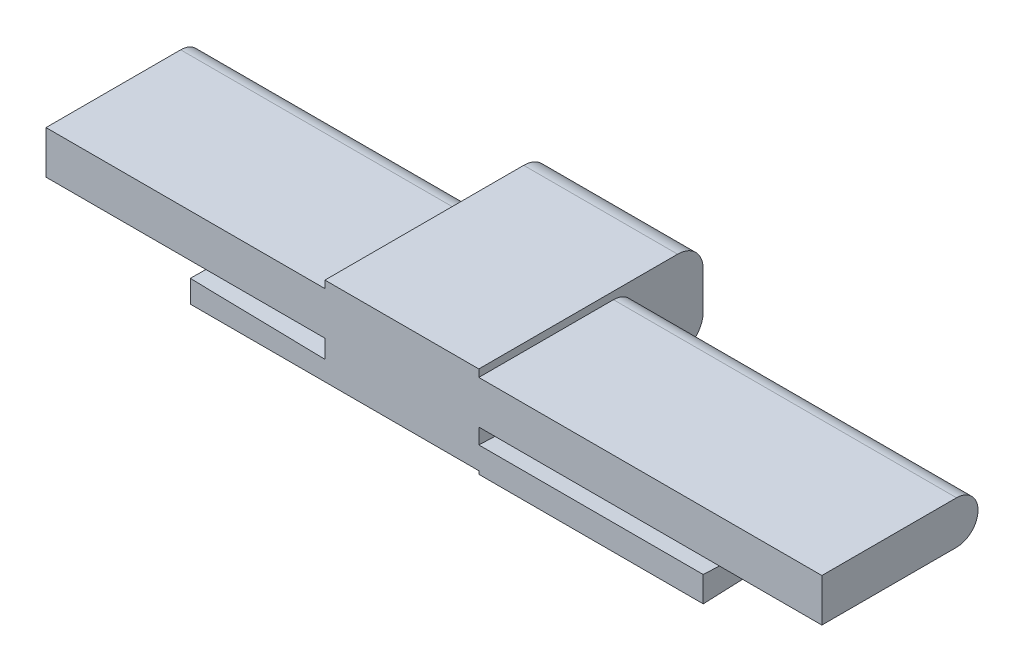
ISO-10303-21;
HEADER;
FILE_DESCRIPTION(('STEP AP214'),'2;1');
FILE_NAME('part.step','',(''),(''),'','','');
FILE_SCHEMA(('AUTOMOTIVE_DESIGN { 1 0 10303 214 1 1 1 1 }'));
ENDSEC;
DATA;
#1=APPLICATION_CONTEXT('core data for automotive mechanical design processes');
#2=APPLICATION_PROTOCOL_DEFINITION('international standard','automotive_design',2000,#1);
#3=PRODUCT_CONTEXT('',#1,'mechanical');
#4=PRODUCT('Part','Part','',(#3));
#5=PRODUCT_RELATED_PRODUCT_CATEGORY('part','',(#4));
#6=PRODUCT_DEFINITION_FORMATION('','',#4);
#7=PRODUCT_DEFINITION_CONTEXT('part definition',#1,'design');
#8=PRODUCT_DEFINITION('design','',#6,#7);
#9=PRODUCT_DEFINITION_SHAPE('','',#8);
#10=(LENGTH_UNIT() NAMED_UNIT(*) SI_UNIT(.MILLI.,.METRE.));
#11=(NAMED_UNIT(*) PLANE_ANGLE_UNIT() SI_UNIT($,.RADIAN.));
#12=(NAMED_UNIT(*) SI_UNIT($,.STERADIAN.) SOLID_ANGLE_UNIT());
#13=UNCERTAINTY_MEASURE_WITH_UNIT(LENGTH_MEASURE(1.E-05),#10,'distance_accuracy_value','');
#14=(GEOMETRIC_REPRESENTATION_CONTEXT(3) GLOBAL_UNCERTAINTY_ASSIGNED_CONTEXT((#13)) GLOBAL_UNIT_ASSIGNED_CONTEXT((#10,
#11,#12)) REPRESENTATION_CONTEXT('',''));
#15=CARTESIAN_POINT('',(0.,0.,0.));
#16=DIRECTION('',(0.,0.,1.));
#17=DIRECTION('',(1.,0.,0.));
#18=AXIS2_PLACEMENT_3D('',#15,#16,#17);
#19=CARTESIAN_POINT('',(-48.,-10.5,-20.));
#20=DIRECTION('',(1.,0.,0.));
#21=DIRECTION('',(0.,0.,-1.));
#22=AXIS2_PLACEMENT_3D('',#19,#20,#21);
#23=CYLINDRICAL_SURFACE('',#22,8.);
#24=DIRECTION('',(1.,0.,0.));
#25=VECTOR('',#24,1.);
#26=CARTESIAN_POINT('',(-48.,-18.5,-20.));
#27=LINE('',#26,#25);
#28=CARTESIAN_POINT('',(-43.,-18.5,-20.));
#29=VERTEX_POINT('',#28);
#30=CARTESIAN_POINT('',(0.,-18.5,-20.));
#31=VERTEX_POINT('',#30);
#32=EDGE_CURVE('E328',#29,#31,#27,.T.);
#33=ORIENTED_EDGE('',*,*,#32,.F.);
#34=CARTESIAN_POINT('',(-43.,-10.5,-20.));
#35=DIRECTION('',(-1.,0.,0.));
#36=DIRECTION('',(0.,0.,1.));
#37=AXIS2_PLACEMENT_3D('',#34,#35,#36);
#38=CIRCLE('',#37,8.);
#39=CARTESIAN_POINT('',(-43.,-12.5875397966806,-27.7228366568413));
#40=VERTEX_POINT('',#39);
#41=EDGE_CURVE('E12',#29,#40,#38,.F.);
#42=ORIENTED_EDGE('',*,*,#41,.T.);
#43=CARTESIAN_POINT('',(-48.,-13.6967004610618,-27.3335602651269));
#44=CARTESIAN_POINT('',(-47.8389697230752,-13.6398955103167,-27.3583185612962));
#45=CARTESIAN_POINT('',(-47.677103874225,-13.5847974795609,-27.3815533120948));
#46=CARTESIAN_POINT('',(-47.3523067433545,-13.4783722059189,-27.4251334653231));
#47=CARTESIAN_POINT('',(-47.1893802123724,-13.4270339818583,-27.4454874583811));
#48=CARTESIAN_POINT('',(-46.8624562814894,-13.328249014456,-27.4835686959774));
#49=CARTESIAN_POINT('',(-46.698462155731,-13.2807936944668,-27.5013018035672));
#50=CARTESIAN_POINT('',(-46.36939893944,-13.1898803208187,-27.5343799508672));
#51=CARTESIAN_POINT('',(-46.2043318395424,-13.1464163554144,-27.5497285464811));
#52=CARTESIAN_POINT('',(-45.8731224947852,-13.0635718566606,-27.5782595164101));
#53=CARTESIAN_POINT('',(-45.706981146665,-13.0241882926896,-27.5914435027553));
#54=CARTESIAN_POINT('',(-45.3736303463596,-12.9495695114106,-27.6158486068268));
#55=CARTESIAN_POINT('',(-45.2064209185207,-12.9143341998983,-27.6270697691306));
#56=CARTESIAN_POINT('',(-44.8709305576168,-12.848055985146,-27.647734312358));
#57=CARTESIAN_POINT('',(-44.7026488993463,-12.8170163272201,-27.6571763193141));
#58=CARTESIAN_POINT('',(-44.3650201062683,-12.7591373641082,-27.674451689023));
#59=CARTESIAN_POINT('',(-44.1956717463166,-12.732304472024,-27.6822826012722));
#60=CARTESIAN_POINT('',(-43.8558754869594,-12.6830598410332,-27.6964220909785));
#61=CARTESIAN_POINT('',(-43.6854259658722,-12.6606582539728,-27.7027271800785));
#62=CARTESIAN_POINT('',(-43.3433992374249,-12.6204899837076,-27.7138797639299));
#63=CARTESIAN_POINT('',(-43.1718201725238,-12.6027378661954,-27.718722685124));
#64=CARTESIAN_POINT('',(-43.,-12.5874496566414,-27.7228591810927));
#65=B_SPLINE_CURVE_WITH_KNOTS('',3,(#43,#44,#45,#46,#47,#48,#49,#50,#51,#52,#53,#54,#55,#56,#57,
#58,#59,#60,#61,#62,#63,#64),.UNSPECIFIED.,.F.,.F.,(4,2,2,2,2,2,2,2,2,2,4),(0.,
0.517605927662018,1.0336342390925,1.54849010450508,2.06257066474247,2.57626662459086,
3.08995091646978,3.60403029393422,4.11888590681755,4.63490769888073,5.15252723560529),.UNSPECIFIED.);
#66=CARTESIAN_POINT('',(-48.,-13.6967004610618,-27.3335602651269));
#67=VERTEX_POINT('',#66);
#68=EDGE_CURVE('E439',#67,#40,#65,.T.);
#69=ORIENTED_EDGE('',*,*,#68,.F.);
#70=CARTESIAN_POINT('',(-48.,-10.5,-20.));
#71=DIRECTION('',(1.,0.,0.));
#72=DIRECTION('',(0.,0.,-1.));
#73=AXIS2_PLACEMENT_3D('',#70,#71,#72);
#74=CIRCLE('',#73,8.);
#75=CARTESIAN_POINT('',(-48.,-10.5,-28.));
#76=VERTEX_POINT('',#75);
#77=EDGE_CURVE('E526',#67,#76,#74,.T.);
#78=ORIENTED_EDGE('',*,*,#77,.T.);
#79=DIRECTION('',(1.,0.,0.));
#80=VECTOR('',#79,1.);
#81=CARTESIAN_POINT('',(-48.,-10.5,-28.));
#82=LINE('',#81,#80);
#83=CARTESIAN_POINT('',(0.,-10.5,-28.));
#84=VERTEX_POINT('',#83);
#85=EDGE_CURVE('E324',#76,#84,#82,.T.);
#86=ORIENTED_EDGE('',*,*,#85,.T.);
#87=CARTESIAN_POINT('',(0.,-10.5,-20.));
#88=DIRECTION('',(1.,0.,0.));
#89=DIRECTION('',(0.,0.,-1.));
#90=AXIS2_PLACEMENT_3D('',#87,#88,#89);
#91=CIRCLE('',#90,8.);
#92=EDGE_CURVE('E490',#31,#84,#91,.T.);
#93=ORIENTED_EDGE('',*,*,#92,.F.);
#94=EDGE_LOOP('',(#33,#42,#69,#78,#86,#93));
#95=FACE_BOUND('',#94,.T.);
#96=ADVANCED_FACE('F107',(#95),#23,.T.);
#97=CARTESIAN_POINT('',(0.,-10.5,-20.));
#98=DIRECTION('',(1.,0.,0.));
#99=DIRECTION('',(0.,0.,-1.));
#100=AXIS2_PLACEMENT_3D('',#97,#98,#99);
#101=PLANE('',#100);
#102=DIRECTION('',(0.,0.0401387347102189,-0.999194116263633));
#103=VECTOR('',#102,1.);
#104=CARTESIAN_POINT('',(0.,-17.4999999858449,-6.99976204961802));
#105=LINE('',#104,#103);
#106=CARTESIAN_POINT('',(0.,-18.5,17.8937513513662));
#107=VERTEX_POINT('',#106);
#108=CARTESIAN_POINT('',(0.,-17.4999999858449,-6.99976204961802));
#109=VERTEX_POINT('',#108);
#110=EDGE_CURVE('E344',#107,#109,#105,.T.);
#111=ORIENTED_EDGE('',*,*,#110,.F.);
#112=DIRECTION('',(0.,0.,-1.));
#113=VECTOR('',#112,1.);
#114=CARTESIAN_POINT('',(0.,-18.5,42.));
#115=LINE('',#114,#113);
#116=EDGE_CURVE('E493',#107,#31,#115,.T.);
#117=ORIENTED_EDGE('',*,*,#116,.T.);
#118=ORIENTED_EDGE('',*,*,#92,.T.);
#119=DIRECTION('',(0.,1.,0.));
#120=VECTOR('',#119,1.);
#121=CARTESIAN_POINT('',(0.,-10.5,-28.));
#122=LINE('',#121,#120);
#123=CARTESIAN_POINT('',(0.,1.,-28.));
#124=VERTEX_POINT('',#123);
#125=EDGE_CURVE('E509',#84,#124,#122,.T.);
#126=ORIENTED_EDGE('',*,*,#125,.T.);
#127=CARTESIAN_POINT('',(0.,1.,-20.));
#128=DIRECTION('',(1.,0.,0.));
#129=DIRECTION('',(0.,0.,-1.));
#130=AXIS2_PLACEMENT_3D('',#127,#128,#129);
#131=CIRCLE('',#130,8.);
#132=CARTESIAN_POINT('',(0.,9.,-20.));
#133=VERTEX_POINT('',#132);
#134=EDGE_CURVE('E514',#124,#133,#131,.T.);
#135=ORIENTED_EDGE('',*,*,#134,.T.);
#136=DIRECTION('',(0.,0.,1.));
#137=VECTOR('',#136,1.);
#138=CARTESIAN_POINT('',(0.,8.99999999999999,42.));
#139=LINE('',#138,#137);
#140=CARTESIAN_POINT('',(0.,8.99999999999999,42.));
#141=VERTEX_POINT('',#140);
#142=EDGE_CURVE('E516',#133,#141,#139,.T.);
#143=ORIENTED_EDGE('',*,*,#142,.T.);
#144=DIRECTION('',(0.,-1.,0.));
#145=VECTOR('',#144,1.);
#146=CARTESIAN_POINT('',(0.,-18.5,42.));
#147=LINE('',#146,#145);
#148=CARTESIAN_POINT('',(0.,6.7,42.));
#149=VERTEX_POINT('',#148);
#150=EDGE_CURVE('E313',#141,#149,#147,.T.);
#151=ORIENTED_EDGE('',*,*,#150,.T.);
#152=DIRECTION('',(0.,0.,1.));
#153=VECTOR('',#152,1.);
#154=CARTESIAN_POINT('',(0.,6.7,-20.));
#155=LINE('',#154,#153);
#156=CARTESIAN_POINT('',(0.,6.7,0.));
#157=VERTEX_POINT('',#156);
#158=EDGE_CURVE('E347',#157,#149,#155,.T.);
#159=ORIENTED_EDGE('',*,*,#158,.F.);
#160=CARTESIAN_POINT('',(0.,0.,0.));
#161=DIRECTION('',(1.,0.,0.));
#162=DIRECTION('',(0.,0.,-1.));
#163=AXIS2_PLACEMENT_3D('',#160,#161,#162);
#164=CIRCLE('',#163,6.7);
#165=CARTESIAN_POINT('',(0.,-6.7,0.));
#166=VERTEX_POINT('',#165);
#167=EDGE_CURVE('E306',#166,#157,#164,.T.);
#168=ORIENTED_EDGE('',*,*,#167,.F.);
#169=DIRECTION('',(0.,0.,-1.));
#170=VECTOR('',#169,1.);
#171=CARTESIAN_POINT('',(0.,-6.7,-20.));
#172=LINE('',#171,#170);
#173=CARTESIAN_POINT('',(0.,-6.7,42.));
#174=VERTEX_POINT('',#173);
#175=EDGE_CURVE('E305',#174,#166,#172,.T.);
#176=ORIENTED_EDGE('',*,*,#175,.F.);
#177=CARTESIAN_POINT('',(0.,-11.5316252831989,42.));
#178=VERTEX_POINT('',#177);
#179=EDGE_CURVE('E518',#174,#178,#147,.T.);
#180=ORIENTED_EDGE('',*,*,#179,.T.);
#181=DIRECTION('',(0.,0.0401317925325526,0.999194395114446));
#182=VECTOR('',#181,1.);
#183=CARTESIAN_POINT('',(0.,-13.5000190335326,-7.00872546663215));
#184=LINE('',#183,#182);
#185=CARTESIAN_POINT('',(0.,-13.5000190335326,-7.00872546663215));
#186=VERTEX_POINT('',#185);
#187=EDGE_CURVE('E861',#186,#178,#184,.T.);
#188=ORIENTED_EDGE('',*,*,#187,.F.);
#189=CARTESIAN_POINT('',(0.,-15.5,-7.));
#190=DIRECTION('',(1.,0.,0.));
#191=DIRECTION('',(0.,0.,-1.));
#192=AXIS2_PLACEMENT_3D('',#189,#190,#191);
#193=CIRCLE('',#192,2.);
#194=EDGE_CURVE('E867',#109,#186,#193,.T.);
#195=ORIENTED_EDGE('',*,*,#194,.F.);
#196=EDGE_LOOP('',(#111,#117,#118,#126,#135,#143,#151,#159,#168,#176,#180,#188,#195));
#197=FACE_BOUND('',#196,.T.);
#198=ADVANCED_FACE('F494',(#197),#101,.T.);
#199=CARTESIAN_POINT('',(-48.,-18.5,42.));
#200=DIRECTION('',(0.,-1.,0.));
#201=DIRECTION('',(0.,0.,-1.));
#202=AXIS2_PLACEMENT_3D('',#199,#200,#201);
#203=PLANE('',#202);
#204=DIRECTION('',(0.,0.,1.));
#205=VECTOR('',#204,1.);
#206=CARTESIAN_POINT('',(-43.,-18.5,-27.));
#207=LINE('',#206,#205);
#208=CARTESIAN_POINT('',(-43.,-18.5,42.));
#209=VERTEX_POINT('',#208);
#210=EDGE_CURVE('E268',#29,#209,#207,.T.);
#211=ORIENTED_EDGE('',*,*,#210,.F.);
#212=ORIENTED_EDGE('',*,*,#32,.T.);
#213=ORIENTED_EDGE('',*,*,#116,.F.);
#214=CARTESIAN_POINT('',(0.,-18.5,42.));
#215=VERTEX_POINT('',#214);
#216=EDGE_CURVE('E293',#215,#107,#115,.T.);
#217=ORIENTED_EDGE('',*,*,#216,.F.);
#218=DIRECTION('',(1.,0.,0.));
#219=VECTOR('',#218,1.);
#220=CARTESIAN_POINT('',(-48.,-18.5,42.));
#221=LINE('',#220,#219);
#222=EDGE_CURVE('E288',#209,#215,#221,.T.);
#223=ORIENTED_EDGE('',*,*,#222,.F.);
#224=EDGE_LOOP('',(#211,#212,#213,#217,#223));
#225=FACE_BOUND('',#224,.T.);
#226=ADVANCED_FACE('F111',(#225),#203,.T.);
#227=CARTESIAN_POINT('',(-48.,-18.5,42.));
#228=DIRECTION('',(0.,0.,1.));
#229=DIRECTION('',(1.,0.,0.));
#230=AXIS2_PLACEMENT_3D('',#227,#228,#229);
#231=PLANE('',#230);
#232=CARTESIAN_POINT('',(-90.,-18.5,42.));
#233=VERTEX_POINT('',#232);
#234=EDGE_CURVE('E274',#233,#209,#221,.T.);
#235=ORIENTED_EDGE('',*,*,#234,.T.);
#236=ORIENTED_EDGE('',*,*,#222,.T.);
#237=DIRECTION('',(0.,-1.,0.));
#238=VECTOR('',#237,1.);
#239=CARTESIAN_POINT('',(0.,-19.4683747168011,42.));
#240=LINE('',#239,#238);
#241=CARTESIAN_POINT('',(0.,-19.4683747168011,42.));
#242=VERTEX_POINT('',#241);
#243=EDGE_CURVE('E857',#215,#242,#240,.T.);
#244=ORIENTED_EDGE('',*,*,#243,.T.);
#245=DIRECTION('',(-1.,0.,0.));
#246=VECTOR('',#245,1.);
#247=CARTESIAN_POINT('',(70.,-19.4683747168011,42.));
#248=LINE('',#247,#246);
#249=CARTESIAN_POINT('',(70.,-19.4683747168011,42.));
#250=VERTEX_POINT('',#249);
#251=EDGE_CURVE('E871',#250,#242,#248,.T.);
#252=ORIENTED_EDGE('',*,*,#251,.F.);
#253=DIRECTION('',(0.,-1.,0.));
#254=VECTOR('',#253,1.);
#255=CARTESIAN_POINT('',(70.,-19.4683747168011,42.));
#256=LINE('',#255,#254);
#257=CARTESIAN_POINT('',(70.,-11.5316252831989,42.));
#258=VERTEX_POINT('',#257);
#259=EDGE_CURVE('E876',#258,#250,#256,.T.);
#260=ORIENTED_EDGE('',*,*,#259,.F.);
#261=DIRECTION('',(-1.,0.,0.));
#262=VECTOR('',#261,1.);
#263=CARTESIAN_POINT('',(70.,-11.5316252831989,42.));
#264=LINE('',#263,#262);
#265=EDGE_CURVE('E634',#258,#178,#264,.T.);
#266=ORIENTED_EDGE('',*,*,#265,.T.);
#267=ORIENTED_EDGE('',*,*,#179,.F.);
#268=DIRECTION('',(1.,0.,0.));
#269=VECTOR('',#268,1.);
#270=CARTESIAN_POINT('',(-135.,-6.70000000000001,42.));
#271=LINE('',#270,#269);
#272=CARTESIAN_POINT('',(107.,-6.70000000000001,42.));
#273=VERTEX_POINT('',#272);
#274=EDGE_CURVE('E590',#174,#273,#271,.T.);
#275=ORIENTED_EDGE('',*,*,#274,.T.);
#276=DIRECTION('',(0.,-1.,0.));
#277=VECTOR('',#276,1.);
#278=CARTESIAN_POINT('',(107.,-6.70000000000001,42.));
#279=LINE('',#278,#277);
#280=CARTESIAN_POINT('',(107.,6.70000000000001,42.));
#281=VERTEX_POINT('',#280);
#282=EDGE_CURVE('E617',#281,#273,#279,.T.);
#283=ORIENTED_EDGE('',*,*,#282,.F.);
#284=DIRECTION('',(1.,0.,0.));
#285=VECTOR('',#284,1.);
#286=CARTESIAN_POINT('',(-135.,6.70000000000001,42.));
#287=LINE('',#286,#285);
#288=EDGE_CURVE('E572',#149,#281,#287,.T.);
#289=ORIENTED_EDGE('',*,*,#288,.F.);
#290=ORIENTED_EDGE('',*,*,#150,.F.);
#291=DIRECTION('',(1.,0.,0.));
#292=VECTOR('',#291,1.);
#293=CARTESIAN_POINT('',(-48.,8.99999999999999,42.));
#294=LINE('',#293,#292);
#295=CARTESIAN_POINT('',(-48.,8.99999999999999,42.));
#296=VERTEX_POINT('',#295);
#297=EDGE_CURVE('E294',#296,#141,#294,.T.);
#298=ORIENTED_EDGE('',*,*,#297,.F.);
#299=DIRECTION('',(0.,-1.,0.));
#300=VECTOR('',#299,1.);
#301=CARTESIAN_POINT('',(-48.,-18.5,42.));
#302=LINE('',#301,#300);
#303=CARTESIAN_POINT('',(-48.,6.70000000000001,42.));
#304=VERTEX_POINT('',#303);
#305=EDGE_CURVE('E333',#296,#304,#302,.T.);
#306=ORIENTED_EDGE('',*,*,#305,.T.);
#307=CARTESIAN_POINT('',(-135.,6.70000000000001,42.));
#308=VERTEX_POINT('',#307);
#309=EDGE_CURVE('E554',#308,#304,#287,.T.);
#310=ORIENTED_EDGE('',*,*,#309,.F.);
#311=DIRECTION('',(0.,-1.,0.));
#312=VECTOR('',#311,1.);
#313=CARTESIAN_POINT('',(-135.,-6.70000000000001,42.));
#314=LINE('',#313,#312);
#315=CARTESIAN_POINT('',(-135.,-6.70000000000001,42.));
#316=VERTEX_POINT('',#315);
#317=EDGE_CURVE('E593',#308,#316,#314,.T.);
#318=ORIENTED_EDGE('',*,*,#317,.T.);
#319=CARTESIAN_POINT('',(-48.,-6.70000000000001,42.));
#320=VERTEX_POINT('',#319);
#321=EDGE_CURVE('E583',#316,#320,#271,.T.);
#322=ORIENTED_EDGE('',*,*,#321,.T.);
#323=CARTESIAN_POINT('',(-48.,-12.3969814131062,42.));
#324=VERTEX_POINT('',#323);
#325=EDGE_CURVE('E544',#320,#324,#302,.T.);
#326=ORIENTED_EDGE('',*,*,#325,.T.);
#327=DIRECTION('',(0.999787810970477,-0.0205993454959516,0.));
#328=VECTOR('',#327,1.);
#329=CARTESIAN_POINT('',(-66.5,-12.0158126415994,42.));
#330=LINE('',#329,#328);
#331=CARTESIAN_POINT('',(-90.,-11.5316252831989,42.));
#332=VERTEX_POINT('',#331);
#333=EDGE_CURVE('E414',#332,#324,#330,.T.);
#334=ORIENTED_EDGE('',*,*,#333,.F.);
#335=DIRECTION('',(0.,1.,0.));
#336=VECTOR('',#335,1.);
#337=CARTESIAN_POINT('',(-90.,-18.5,42.));
#338=LINE('',#337,#336);
#339=EDGE_CURVE('E299',#233,#332,#338,.T.);
#340=ORIENTED_EDGE('',*,*,#339,.F.);
#341=EDGE_LOOP('',(#235,#236,#244,#252,#260,#266,#267,#275,#283,#289,#290,#298,#306,#310,#318,
#322,#326,#334,#340));
#342=FACE_BOUND('',#341,.T.);
#343=ADVANCED_FACE('F300',(#342),#231,.T.);
#344=CARTESIAN_POINT('',(-48.,8.99999999999999,42.));
#345=DIRECTION('',(0.,1.,0.));
#346=DIRECTION('',(0.,0.,1.));
#347=AXIS2_PLACEMENT_3D('',#344,#345,#346);
#348=PLANE('',#347);
#349=ORIENTED_EDGE('',*,*,#142,.F.);
#350=DIRECTION('',(1.,0.,0.));
#351=VECTOR('',#350,1.);
#352=CARTESIAN_POINT('',(-48.,9.,-20.));
#353=LINE('',#352,#351);
#354=CARTESIAN_POINT('',(-48.,9.,-20.));
#355=VERTEX_POINT('',#354);
#356=EDGE_CURVE('E316',#355,#133,#353,.T.);
#357=ORIENTED_EDGE('',*,*,#356,.F.);
#358=DIRECTION('',(0.,0.,1.));
#359=VECTOR('',#358,1.);
#360=CARTESIAN_POINT('',(-48.,8.99999999999999,42.));
#361=LINE('',#360,#359);
#362=EDGE_CURVE('E542',#355,#296,#361,.T.);
#363=ORIENTED_EDGE('',*,*,#362,.T.);
#364=ORIENTED_EDGE('',*,*,#297,.T.);
#365=EDGE_LOOP('',(#349,#357,#363,#364));
#366=FACE_BOUND('',#365,.T.);
#367=ADVANCED_FACE('F674',(#366),#348,.T.);
#368=CARTESIAN_POINT('',(-48.,1.,-20.));
#369=DIRECTION('',(1.,0.,0.));
#370=DIRECTION('',(0.,0.,-1.));
#371=AXIS2_PLACEMENT_3D('',#368,#369,#370);
#372=CYLINDRICAL_SURFACE('',#371,8.);
#373=ORIENTED_EDGE('',*,*,#134,.F.);
#374=DIRECTION('',(1.,0.,0.));
#375=VECTOR('',#374,1.);
#376=CARTESIAN_POINT('',(-48.,1.,-28.));
#377=LINE('',#376,#375);
#378=CARTESIAN_POINT('',(-48.,1.,-28.));
#379=VERTEX_POINT('',#378);
#380=EDGE_CURVE('E325',#379,#124,#377,.T.);
#381=ORIENTED_EDGE('',*,*,#380,.F.);
#382=CARTESIAN_POINT('',(-48.,1.,-20.));
#383=DIRECTION('',(1.,0.,0.));
#384=DIRECTION('',(0.,0.,-1.));
#385=AXIS2_PLACEMENT_3D('',#382,#383,#384);
#386=CIRCLE('',#385,8.);
#387=EDGE_CURVE('E533',#379,#355,#386,.T.);
#388=ORIENTED_EDGE('',*,*,#387,.T.);
#389=ORIENTED_EDGE('',*,*,#356,.T.);
#390=EDGE_LOOP('',(#373,#381,#388,#389));
#391=FACE_BOUND('',#390,.T.);
#392=ADVANCED_FACE('F669',(#391),#372,.T.);
#393=CARTESIAN_POINT('',(-48.,-10.5,-28.));
#394=DIRECTION('',(0.,0.,-1.));
#395=DIRECTION('',(0.,1.,0.));
#396=AXIS2_PLACEMENT_3D('',#393,#394,#395);
#397=PLANE('',#396);
#398=ORIENTED_EDGE('',*,*,#125,.F.);
#399=ORIENTED_EDGE('',*,*,#85,.F.);
#400=DIRECTION('',(0.,1.,0.));
#401=VECTOR('',#400,1.);
#402=CARTESIAN_POINT('',(-48.,-10.5,-28.));
#403=LINE('',#402,#401);
#404=EDGE_CURVE('E527',#76,#379,#403,.T.);
#405=ORIENTED_EDGE('',*,*,#404,.T.);
#406=ORIENTED_EDGE('',*,*,#380,.T.);
#407=EDGE_LOOP('',(#398,#399,#405,#406));
#408=FACE_BOUND('',#407,.T.);
#409=ADVANCED_FACE('F670',(#408),#397,.T.);
#410=CARTESIAN_POINT('',(-48.,-10.5,-20.));
#411=DIRECTION('',(1.,0.,0.));
#412=DIRECTION('',(0.,0.,-1.));
#413=AXIS2_PLACEMENT_3D('',#410,#411,#412);
#414=PLANE('',#413);
#415=ORIENTED_EDGE('',*,*,#77,.F.);
#416=CARTESIAN_POINT('',(-48.,-18.5,-25.440633949074));
#417=CARTESIAN_POINT('',(-48.,-18.4839846155434,-25.5250908439624));
#418=CARTESIAN_POINT('',(-48.,-18.4642489269962,-25.6088293766755));
#419=CARTESIAN_POINT('',(-48.,-18.4176548526095,-25.7742691559954));
#420=CARTESIAN_POINT('',(-48.,-18.3907991324534,-25.855971152567));
#421=CARTESIAN_POINT('',(-48.,-18.3302844479619,-26.0167641522077));
#422=CARTESIAN_POINT('',(-48.,-18.2966286321276,-26.0958563439946));
#423=CARTESIAN_POINT('',(-48.,-18.2229542221598,-26.2510343598707));
#424=CARTESIAN_POINT('',(-48.,-18.1829345290626,-26.3271196618685));
#425=CARTESIAN_POINT('',(-48.,-18.0967055191065,-26.4756937230655));
#426=CARTESIAN_POINT('',(-48.,-18.0504967746815,-26.5481828140347));
#427=CARTESIAN_POINT('',(-48.,-17.9521788570262,-26.6890075321942));
#428=CARTESIAN_POINT('',(-48.,-17.9000715550834,-26.7573444661217));
#429=CARTESIAN_POINT('',(-48.,-17.7903195183422,-26.889354798452));
#430=CARTESIAN_POINT('',(-48.,-17.7326781419735,-26.9530309844552));
#431=CARTESIAN_POINT('',(-48.,-17.6122057311327,-27.0753659084259));
#432=CARTESIAN_POINT('',(-48.,-17.5493694451232,-27.134019444022));
#433=CARTESIAN_POINT('',(-48.,-17.3533307314449,-27.3021168276306));
#434=CARTESIAN_POINT('',(-48.,-17.2129073169472,-27.4033264986245));
#435=CARTESIAN_POINT('',(-48.,-16.9170097750761,-27.5806392900527));
#436=CARTESIAN_POINT('',(-48.,-16.761535896851,-27.656742826007));
#437=CARTESIAN_POINT('',(-48.,-16.5207341729287,-27.7502358097404));
#438=CARTESIAN_POINT('',(-48.,-16.4392811346693,-27.7779402072979));
#439=CARTESIAN_POINT('',(-48.,-16.2744044098786,-27.8263506777092));
#440=CARTESIAN_POINT('',(-48.,-16.190983156646,-27.847064952438));
#441=CARTESIAN_POINT('',(-48.,-16.022698861736,-27.8813827584959));
#442=CARTESIAN_POINT('',(-48.,-15.9378358729323,-27.8949865500142));
#443=CARTESIAN_POINT('',(-48.,-15.7671632231894,-27.9149867571708));
#444=CARTESIAN_POINT('',(-48.,-15.6813525705875,-27.9213747193784));
#445=CARTESIAN_POINT('',(-48.,-15.5098815473289,-27.9267902394893));
#446=CARTESIAN_POINT('',(-48.,-15.4242222689696,-27.9258511501826));
#447=CARTESIAN_POINT('',(-48.,-15.2532832228246,-27.9167261567184));
#448=CARTESIAN_POINT('',(-48.,-15.1680036540393,-27.9085368198765));
#449=CARTESIAN_POINT('',(-48.,-14.9136707884873,-27.873212223668));
#450=CARTESIAN_POINT('',(-48.,-14.7459287687225,-27.8353261881997));
#451=CARTESIAN_POINT('',(-48.,-14.5012778097052,-27.7579618102052));
#452=CARTESIAN_POINT('',(-48.,-14.4209265215419,-27.7287709761277));
#453=CARTESIAN_POINT('',(-48.,-14.2630135572808,-27.6637567600362));
#454=CARTESIAN_POINT('',(-48.,-14.1854492221752,-27.6279399119453));
#455=CARTESIAN_POINT('',(-48.,-14.0334926382487,-27.5498826963715));
#456=CARTESIAN_POINT('',(-48.,-13.9591047673997,-27.5076338079618));
#457=CARTESIAN_POINT('',(-48.,-13.8141292096157,-27.4170700344506));
#458=CARTESIAN_POINT('',(-48.,-13.7435424483817,-27.3687536811729));
#459=CARTESIAN_POINT('',(-48.,-13.5375822397072,-27.2146733202319));
#460=CARTESIAN_POINT('',(-48.,-13.408588090378,-27.1000758288484));
#461=CARTESIAN_POINT('',(-48.,-13.2311677188966,-26.9135224463125));
#462=CARTESIAN_POINT('',(-48.,-13.1747304050466,-26.8489312668827));
#463=CARTESIAN_POINT('',(-48.,-13.0674596752912,-26.7152213099644));
#464=CARTESIAN_POINT('',(-48.,-13.0166253141581,-26.6461032993063));
#465=CARTESIAN_POINT('',(-48.,-12.9367697476384,-26.5274271342912));
#466=CARTESIAN_POINT('',(-48.,-12.9060975924892,-26.4789667335344));
#467=CARTESIAN_POINT('',(-48.,-12.8474875414853,-26.3804008261311));
#468=CARTESIAN_POINT('',(-48.,-12.8195502410032,-26.3302949644273));
#469=CARTESIAN_POINT('',(-48.,-12.7664574457639,-26.2285844046984));
#470=CARTESIAN_POINT('',(-48.,-12.7413040581226,-26.1769786081862));
#471=CARTESIAN_POINT('',(-48.,-12.6938434708079,-26.0724109602828));
#472=CARTESIAN_POINT('',(-48.,-12.6715391871871,-26.0194477851183));
#473=CARTESIAN_POINT('',(-48.,-12.6299648882004,-25.9123872047101));
#474=CARTESIAN_POINT('',(-48.,-12.6106924714499,-25.8582907359692));
#475=CARTESIAN_POINT('',(-48.,-12.5841507311526,-25.7764709818893));
#476=CARTESIAN_POINT('',(-48.,-12.5757080461235,-25.7491236310096));
#477=CARTESIAN_POINT('',(-48.,-12.5596066568409,-25.6941919871213));
#478=CARTESIAN_POINT('',(-48.,-12.5519481597161,-25.6666076335876));
#479=CARTESIAN_POINT('',(-48.,-12.5280311586426,-25.5753932686886));
#480=CARTESIAN_POINT('',(-48.,-12.51346711828,-25.5113059195094));
#481=CARTESIAN_POINT('',(-48.,-12.4948210611821,-25.4145872996843));
#482=CARTESIAN_POINT('',(-48.,-12.4891394546487,-25.3822531194244));
#483=CARTESIAN_POINT('',(-48.,-12.4788414113771,-25.3174116288977));
#484=CARTESIAN_POINT('',(-48.,-12.4742250385559,-25.2849043083617));
#485=CARTESIAN_POINT('',(-48.,-12.4660462969508,-25.2196685566129));
#486=CARTESIAN_POINT('',(-48.,-12.4624868201919,-25.1869397648535));
#487=CARTESIAN_POINT('',(-48.,-12.4564347100985,-25.1213883889478));
#488=CARTESIAN_POINT('',(-48.,-12.4539419049234,-25.0885658207672));
#489=CARTESIAN_POINT('',(-48.,-12.450992844008,-25.0392762295171));
#490=CARTESIAN_POINT('',(-48.,-12.4501413722626,-25.0228319243318));
#491=CARTESIAN_POINT('',(-48.,-12.448704600574,-24.9899324310997));
#492=CARTESIAN_POINT('',(-48.,-12.4481192882704,-24.9734772435937));
#493=CARTESIAN_POINT('',(-48.,-12.4471976863248,-24.9405568668397));
#494=CARTESIAN_POINT('',(-48.,-12.446861438208,-24.9240916763816));
#495=CARTESIAN_POINT('',(-48.,-12.4464940168776,-24.8911576039617));
#496=CARTESIAN_POINT('',(-48.,-12.4464628583832,-24.8746887218601));
#497=CARTESIAN_POINT('',(-48.,-12.4464244853146,-24.8416104447317));
#498=CARTESIAN_POINT('',(-48.,-12.446417478021,-24.8250010538649));
#499=CARTESIAN_POINT('',(-48.,-12.4463970341315,-24.7917825030736));
#500=CARTESIAN_POINT('',(-48.,-12.4463835976749,-24.7751733431519));
#501=CARTESIAN_POINT('',(-48.,-12.4463450476987,-24.7253480686948));
#502=CARTESIAN_POINT('',(-48.,-12.4463216915872,-24.6921319895478));
#503=CARTESIAN_POINT('',(-48.,-12.4462737112214,-24.6257077521315));
#504=CARTESIAN_POINT('',(-48.,-12.4462490872717,-24.5924995938683));
#505=CARTESIAN_POINT('',(-48.,-12.4462001527141,-24.52608260598));
#506=CARTESIAN_POINT('',(-48.,-12.4461758421125,-24.492873776355));
#507=CARTESIAN_POINT('',(-48.,-12.4461026013106,-24.3929804418833));
#508=CARTESIAN_POINT('',(-48.,-12.4460535565433,-24.3262959352241));
#509=CARTESIAN_POINT('',(-48.,-12.4459554674386,-24.1929221421243));
#510=CARTESIAN_POINT('',(-48.,-12.4459064231014,-24.1262328556837));
#511=CARTESIAN_POINT('',(-48.,-12.4458082756104,-23.9928793414112));
#512=CARTESIAN_POINT('',(-48.,-12.4457591724856,-23.9262151135795));
#513=CARTESIAN_POINT('',(-48.,-12.4456609132236,-23.7928879422413));
#514=CARTESIAN_POINT('',(-48.,-12.4456117570874,-23.7262249987349));
#515=CARTESIAN_POINT('',(-48.,-12.4455122400843,-23.5913458073263));
#516=CARTESIAN_POINT('',(-48.,-12.4454618778345,-23.5231295594245));
#517=CARTESIAN_POINT('',(-48.,-12.4453610945322,-23.3866967087803));
#518=CARTESIAN_POINT('',(-48.,-12.4453106734795,-23.3184801060379));
#519=CARTESIAN_POINT('',(-48.,-12.4451597686446,-23.1144318016953));
#520=CARTESIAN_POINT('',(-48.,-12.445059199356,-22.9786001001563));
#521=CARTESIAN_POINT('',(-48.,-12.4448581600587,-22.7073653930093));
#522=CARTESIAN_POINT('',(-48.,-12.4447576907385,-22.5719623874008));
#523=CARTESIAN_POINT('',(-48.,-12.4445567350258,-22.3014126189415));
#524=CARTESIAN_POINT('',(-48.,-12.4444562490255,-22.1662658560905));
#525=CARTESIAN_POINT('',(-48.,-12.4442551424569,-21.8960561199763));
#526=CARTESIAN_POINT('',(-48.,-12.4441545220106,-21.7609931467129));
#527=CARTESIAN_POINT('',(-48.0000000000001,-12.4437289950421,-21.1903380730968));
#528=CARTESIAN_POINT('',(-48.,-12.4434032092833,-20.7547459733993));
#529=CARTESIAN_POINT('',(-48.,-12.4427494668652,-19.8828349122641));
#530=CARTESIAN_POINT('',(-48.,-12.4424215074905,-19.4465159508283));
#531=CARTESIAN_POINT('',(-48.,-12.4417638722445,-18.5733444580067));
#532=CARTESIAN_POINT('',(-48.,-12.4414341947645,-18.136491926622));
#533=CARTESIAN_POINT('',(-48.,-12.4407735785347,-17.2624465856925));
#534=CARTESIAN_POINT('',(-48.,-12.4404426390025,-16.8252537761483));
#535=CARTESIAN_POINT('',(-48.,-12.4397799534856,-15.9507211706898));
#536=CARTESIAN_POINT('',(-48.,-12.4394482072671,-15.5133813747758));
#537=CARTESIAN_POINT('',(-48.,-12.4387843615854,-14.6387480883692));
#538=CARTESIAN_POINT('',(-48.,-12.4384522621632,-14.2014545978766));
#539=CARTESIAN_POINT('',(-48.,-12.4377921168535,-13.3323158816075));
#540=CARTESIAN_POINT('',(-48.,-12.437464072014,-12.9004706558301));
#541=CARTESIAN_POINT('',(-48.,-12.4368083326015,-12.0369697520426));
#542=CARTESIAN_POINT('',(-48.,-12.4364806379381,-11.6053140740324));
#543=CARTESIAN_POINT('',(-48.,-12.4358258521307,-10.7421479383911));
#544=CARTESIAN_POINT('',(-48.,-12.4354987608209,-10.3106374807602));
#545=CARTESIAN_POINT('',(-48.,-12.4348454255896,-9.44771745849616));
#546=CARTESIAN_POINT('',(-48.,-12.4345191814879,-9.0163078938633));
#547=CARTESIAN_POINT('',(-48.,-12.4338678049452,-8.15354533019938));
#548=CARTESIAN_POINT('',(-48.,-12.4335426723641,-7.72219233116844));
#549=CARTESIAN_POINT('',(-48.,-12.4328934556457,-6.85949857156003));
#550=CARTESIAN_POINT('',(-48.,-12.4325693714788,-6.4281578109826));
#551=CARTESIAN_POINT('',(-48.,-12.4312476036274,-4.66628731677224));
#552=CARTESIAN_POINT('',(-48.,-12.4302540858289,-3.33575758001243));
#553=CARTESIAN_POINT('',(-48.,-12.4282746361279,-0.674458232762279));
#554=CARTESIAN_POINT('',(-48.,-12.4272887056253,0.656311377729097));
#555=CARTESIAN_POINT('',(-48.,-12.4253229804328,3.31802507979828));
#556=CARTESIAN_POINT('',(-48.,-12.4243431865643,4.64896917137669));
#557=CARTESIAN_POINT('',(-48.,-12.4223883285317,7.31096644300499));
#558=CARTESIAN_POINT('',(-48.,-12.4214132647619,8.64201962305516));
#559=CARTESIAN_POINT('',(-48.,-12.419466483966,11.3041696790298));
#560=CARTESIAN_POINT('',(-48.,-12.4184947670509,12.6352665549543));
#561=CARTESIAN_POINT('',(-48.,-12.4165533099186,15.2974386100897));
#562=CARTESIAN_POINT('',(-48.,-12.4155835696695,16.6285137893006));
#563=CARTESIAN_POINT('',(-48.,-12.4136414869396,19.2950043353823));
#564=CARTESIAN_POINT('',(-48.,-12.4126691462842,20.6304197022544));
#565=CARTESIAN_POINT('',(-48.,-12.4107236630852,23.3011846816266));
#566=CARTESIAN_POINT('',(-48.0000000000001,-12.4097505205836,24.6365342941265));
#567=CARTESIAN_POINT('',(-47.9999999999999,-12.4078020010664,27.3071896788393));
#568=CARTESIAN_POINT('',(-47.9999999999996,-12.4068266241252,28.6424954510522));
#569=CARTESIAN_POINT('',(-48.0000000000004,-12.4048721920317,31.3130850692678));
#570=CARTESIAN_POINT('',(-48.0000000000014,-12.40389313694,32.6483689152706));
#571=CARTESIAN_POINT('',(-47.9999999999986,-12.4019298792723,35.3189365951238));
#572=CARTESIAN_POINT('',(-47.9999999999946,-12.4009456766963,36.6542204289742));
#573=CARTESIAN_POINT('',(-48.0000000000054,-12.3989706195159,39.3248099985574));
#574=CARTESIAN_POINT('',(-48.0000000000202,-12.3979797648027,40.6601157342902));
#575=CARTESIAN_POINT('',(-48.,-12.3969836874411,41.9969476446512));
#576=CARTESIAN_POINT('',(-48.,-12.3969825502764,41.9984738223256));
#577=CARTESIAN_POINT('',(-48.,-12.3969814131062,42.));
#578=B_SPLINE_CURVE_WITH_KNOTS('',3,(#416,#417,#418,#419,#420,#421,#422,#423,#424,#425,#426,
#427,#428,#429,#430,#431,#432,#433,#434,#435,#436,#437,#438,#439,#440,#441,#442,#443,#444,#445,
#446,#447,#448,#449,#450,#451,#452,#453,#454,#455,#456,#457,#458,#459,#460,#461,#462,#463,#464,
#465,#466,#467,#468,#469,#470,#471,#472,#473,#474,#475,#476,#477,#478,#479,#480,#481,#482,#483,
#484,#485,#486,#487,#488,#489,#490,#491,#492,#493,#494,#495,#496,#497,#498,#499,#500,#501,#502,
#503,#504,#505,#506,#507,#508,#509,#510,#511,#512,#513,#514,#515,#516,#517,#518,#519,#520,#521,
#522,#523,#524,#525,#526,#527,#528,#529,#530,#531,#532,#533,#534,#535,#536,#537,#538,#539,#540,
#541,#542,#543,#544,#545,#546,#547,#548,#549,#550,#551,#552,#553,#554,#555,#556,#557,#558,#559,
#560,#561,#562,#563,#564,#565,#566,#567,#568,#569,#570,#571,#572,#573,#574,#575,#576,#577),
.UNSPECIFIED.,.F.,.F.,(4,2,2,2,2,2,2,2,2,2,2,2,2,2,2,2,2,2,2,2,2,2,2,2,2,2,2,2,2,2,2,2,2,2,2,2,
2,2,2,2,2,2,2,2,2,2,2,2,2,2,2,2,2,2,2,2,2,2,2,2,2,2,2,2,2,2,2,2,2,2,2,2,2,2,2,2,2,2,2,2,4),(0.,
0.257785670050448,0.51547496314314,0.773045216230497,1.03065999693894,1.28825096692486,
1.54576044529122,1.80311462654159,2.06073222525943,2.57739712040822,3.09405346404687,
3.35190196145717,3.60944685118873,3.8669823160865,4.12481917498464,4.38148304576242,
4.63826850100702,5.15126245153871,5.40750166527209,5.66348953509425,5.91981952745761,
6.17621166527276,6.69092666597535,6.94802586327013,7.20508162088827,7.37705753915219,
7.54907081337728,7.7212134050002,7.8935307961051,8.065711008802,8.15156321105491,
8.23743803140772,8.43442881596303,8.53290433663677,8.63138576458194,8.73013423883005,
8.8288667987235,8.87826398581986,8.92765887864095,8.97706200494703,9.02646751471326,
9.07629601122063,9.12612342809892,9.22577175211852,9.32539623778887,9.42502275741007,
9.62507632829648,9.82514424257723,10.025136980095,10.2251258650459,10.4297746645059,
10.634424528639,11.0419197449441,11.4481288735931,11.8535692742176,12.2587583064492,
13.5655349710272,14.8744922250984,16.185050192445,17.4966289968412,18.8086487620545,
20.1205296118479,21.4160656629716,22.7110330701597,24.0055648149622,25.2997938789322,
26.5938532436269,27.887875890605,31.8794662136547,35.8717761407847,39.8646094974424,
43.857770109012,47.8510618008306,51.844288398203,55.8505355607883,59.8565854620608,
63.8625038473954,67.8683564621885,71.8742090518725,75.8801273619314,75.8847058962256),.UNSPECIFIED.);
#579=EDGE_CURVE('E125',#67,#324,#578,.T.);
#580=ORIENTED_EDGE('',*,*,#579,.T.);
#581=ORIENTED_EDGE('',*,*,#325,.F.);
#582=DIRECTION('',(0.,0.,-1.));
#583=VECTOR('',#582,1.);
#584=CARTESIAN_POINT('',(-48.,-6.7,-20.));
#585=LINE('',#584,#583);
#586=CARTESIAN_POINT('',(-48.,-6.7,0.));
#587=VERTEX_POINT('',#586);
#588=EDGE_CURVE('E588',#320,#587,#585,.T.);
#589=ORIENTED_EDGE('',*,*,#588,.T.);
#590=CARTESIAN_POINT('',(-48.,0.,0.));
#591=DIRECTION('',(1.,0.,0.));
#592=DIRECTION('',(0.,0.,-1.));
#593=AXIS2_PLACEMENT_3D('',#590,#591,#592);
#594=CIRCLE('',#593,6.7);
#595=CARTESIAN_POINT('',(-48.,6.7,0.));
#596=VERTEX_POINT('',#595);
#597=EDGE_CURVE('E503',#587,#596,#594,.T.);
#598=ORIENTED_EDGE('',*,*,#597,.T.);
#599=DIRECTION('',(0.,0.,1.));
#600=VECTOR('',#599,1.);
#601=CARTESIAN_POINT('',(-48.,6.7,-20.));
#602=LINE('',#601,#600);
#603=EDGE_CURVE('E498',#596,#304,#602,.T.);
#604=ORIENTED_EDGE('',*,*,#603,.T.);
#605=ORIENTED_EDGE('',*,*,#305,.F.);
#606=ORIENTED_EDGE('',*,*,#362,.F.);
#607=ORIENTED_EDGE('',*,*,#387,.F.);
#608=ORIENTED_EDGE('',*,*,#404,.F.);
#609=EDGE_LOOP('',(#415,#580,#581,#589,#598,#604,#605,#606,#607,#608));
#610=FACE_BOUND('',#609,.T.);
#611=ADVANCED_FACE('F350',(#610),#414,.F.);
#612=CARTESIAN_POINT('',(107.,0.,0.));
#613=DIRECTION('',(1.,0.,0.));
#614=DIRECTION('',(0.,0.,-1.));
#615=AXIS2_PLACEMENT_3D('',#612,#613,#614);
#616=PLANE('',#615);
#617=ORIENTED_EDGE('',*,*,#282,.T.);
#618=DIRECTION('',(0.,0.,-1.));
#619=VECTOR('',#618,1.);
#620=CARTESIAN_POINT('',(107.,-6.70000000000001,42.));
#621=LINE('',#620,#619);
#622=CARTESIAN_POINT('',(107.,-6.7,0.));
#623=VERTEX_POINT('',#622);
#624=EDGE_CURVE('E623',#273,#623,#621,.T.);
#625=ORIENTED_EDGE('',*,*,#624,.T.);
#626=CARTESIAN_POINT('',(107.,0.,0.));
#627=DIRECTION('',(1.,0.,0.));
#628=DIRECTION('',(0.,0.,-1.));
#629=AXIS2_PLACEMENT_3D('',#626,#627,#628);
#630=CIRCLE('',#629,6.7);
#631=CARTESIAN_POINT('',(107.,6.7,0.));
#632=VERTEX_POINT('',#631);
#633=EDGE_CURVE('E603',#623,#632,#630,.T.);
#634=ORIENTED_EDGE('',*,*,#633,.T.);
#635=DIRECTION('',(0.,0.,1.));
#636=VECTOR('',#635,1.);
#637=CARTESIAN_POINT('',(107.,6.70000000000001,42.));
#638=LINE('',#637,#636);
#639=EDGE_CURVE('E596',#632,#281,#638,.T.);
#640=ORIENTED_EDGE('',*,*,#639,.T.);
#641=EDGE_LOOP('',(#617,#625,#634,#640));
#642=FACE_BOUND('',#641,.T.);
#643=ADVANCED_FACE('F627',(#642),#616,.T.);
#644=CARTESIAN_POINT('',(-135.,-6.70000000000001,42.));
#645=DIRECTION('',(0.,-1.,0.));
#646=DIRECTION('',(0.,0.,-1.));
#647=AXIS2_PLACEMENT_3D('',#644,#645,#646);
#648=PLANE('',#647);
#649=ORIENTED_EDGE('',*,*,#274,.F.);
#650=ORIENTED_EDGE('',*,*,#175,.T.);
#651=DIRECTION('',(1.,0.,0.));
#652=VECTOR('',#651,1.);
#653=CARTESIAN_POINT('',(-135.,-6.7,0.));
#654=LINE('',#653,#652);
#655=EDGE_CURVE('E582',#166,#623,#654,.T.);
#656=ORIENTED_EDGE('',*,*,#655,.T.);
#657=ORIENTED_EDGE('',*,*,#624,.F.);
#658=EDGE_LOOP('',(#649,#650,#656,#657));
#659=FACE_BOUND('',#658,.T.);
#660=ADVANCED_FACE('F625',(#659),#648,.T.);
#661=CARTESIAN_POINT('',(-135.,0.,0.));
#662=DIRECTION('',(1.,0.,0.));
#663=DIRECTION('',(0.,0.,-1.));
#664=AXIS2_PLACEMENT_3D('',#661,#662,#663);
#665=CYLINDRICAL_SURFACE('',#664,6.7);
#666=ORIENTED_EDGE('',*,*,#655,.F.);
#667=ORIENTED_EDGE('',*,*,#167,.T.);
#668=DIRECTION('',(1.,0.,0.));
#669=VECTOR('',#668,1.);
#670=CARTESIAN_POINT('',(-135.,6.7,0.));
#671=LINE('',#670,#669);
#672=EDGE_CURVE('E573',#157,#632,#671,.T.);
#673=ORIENTED_EDGE('',*,*,#672,.T.);
#674=ORIENTED_EDGE('',*,*,#633,.F.);
#675=EDGE_LOOP('',(#666,#667,#673,#674));
#676=FACE_BOUND('',#675,.T.);
#677=ADVANCED_FACE('F648',(#676),#665,.T.);
#678=CARTESIAN_POINT('',(-135.,6.70000000000001,42.));
#679=DIRECTION('',(0.,1.,0.));
#680=DIRECTION('',(0.,0.,1.));
#681=AXIS2_PLACEMENT_3D('',#678,#679,#680);
#682=PLANE('',#681);
#683=ORIENTED_EDGE('',*,*,#672,.F.);
#684=ORIENTED_EDGE('',*,*,#158,.T.);
#685=ORIENTED_EDGE('',*,*,#288,.T.);
#686=ORIENTED_EDGE('',*,*,#639,.F.);
#687=EDGE_LOOP('',(#683,#684,#685,#686));
#688=FACE_BOUND('',#687,.T.);
#689=ADVANCED_FACE('F645',(#688),#682,.T.);
#690=ORIENTED_EDGE('',*,*,#603,.F.);
#691=CARTESIAN_POINT('',(-135.,6.7,0.));
#692=VERTEX_POINT('',#691);
#693=EDGE_CURVE('E564',#692,#596,#671,.T.);
#694=ORIENTED_EDGE('',*,*,#693,.F.);
#695=DIRECTION('',(0.,0.,1.));
#696=VECTOR('',#695,1.);
#697=CARTESIAN_POINT('',(-135.,6.70000000000001,42.));
#698=LINE('',#697,#696);
#699=EDGE_CURVE('E609',#692,#308,#698,.T.);
#700=ORIENTED_EDGE('',*,*,#699,.T.);
#701=ORIENTED_EDGE('',*,*,#309,.T.);
#702=EDGE_LOOP('',(#690,#694,#700,#701));
#703=FACE_BOUND('',#702,.T.);
#704=ADVANCED_FACE('F563',(#703),#682,.T.);
#705=ORIENTED_EDGE('',*,*,#597,.F.);
#706=CARTESIAN_POINT('',(-135.,-6.7,0.));
#707=VERTEX_POINT('',#706);
#708=EDGE_CURVE('E140',#707,#587,#654,.T.);
#709=ORIENTED_EDGE('',*,*,#708,.F.);
#710=CARTESIAN_POINT('',(-135.,0.,0.));
#711=DIRECTION('',(1.,0.,0.));
#712=DIRECTION('',(0.,0.,-1.));
#713=AXIS2_PLACEMENT_3D('',#710,#711,#712);
#714=CIRCLE('',#713,6.7);
#715=EDGE_CURVE('E569',#707,#692,#714,.T.);
#716=ORIENTED_EDGE('',*,*,#715,.T.);
#717=ORIENTED_EDGE('',*,*,#693,.T.);
#718=EDGE_LOOP('',(#705,#709,#716,#717));
#719=FACE_BOUND('',#718,.T.);
#720=ADVANCED_FACE('F568',(#719),#665,.T.);
#721=ORIENTED_EDGE('',*,*,#588,.F.);
#722=ORIENTED_EDGE('',*,*,#321,.F.);
#723=DIRECTION('',(0.,0.,-1.));
#724=VECTOR('',#723,1.);
#725=CARTESIAN_POINT('',(-135.,-6.70000000000001,42.));
#726=LINE('',#725,#724);
#727=EDGE_CURVE('E600',#316,#707,#726,.T.);
#728=ORIENTED_EDGE('',*,*,#727,.T.);
#729=ORIENTED_EDGE('',*,*,#708,.T.);
#730=EDGE_LOOP('',(#721,#722,#728,#729));
#731=FACE_BOUND('',#730,.T.);
#732=ADVANCED_FACE('F591',(#731),#648,.T.);
#733=CARTESIAN_POINT('',(-135.,0.,0.));
#734=DIRECTION('',(1.,0.,0.));
#735=DIRECTION('',(0.,0.,-1.));
#736=AXIS2_PLACEMENT_3D('',#733,#734,#735);
#737=PLANE('',#736);
#738=ORIENTED_EDGE('',*,*,#317,.F.);
#739=ORIENTED_EDGE('',*,*,#699,.F.);
#740=ORIENTED_EDGE('',*,*,#715,.F.);
#741=ORIENTED_EDGE('',*,*,#727,.F.);
#742=EDGE_LOOP('',(#738,#739,#740,#741));
#743=FACE_BOUND('',#742,.T.);
#744=ADVANCED_FACE('F786',(#743),#737,.F.);
#745=CARTESIAN_POINT('',(0.,-15.5,-7.));
#746=DIRECTION('',(1.,0.,0.));
#747=DIRECTION('',(0.,0.,-1.));
#748=AXIS2_PLACEMENT_3D('',#745,#746,#747);
#749=PLANE('',#748);
#750=ORIENTED_EDGE('',*,*,#243,.F.);
#751=ORIENTED_EDGE('',*,*,#216,.T.);
#752=EDGE_CURVE('E647',#242,#107,#105,.T.);
#753=ORIENTED_EDGE('',*,*,#752,.F.);
#754=EDGE_LOOP('',(#750,#751,#753));
#755=FACE_BOUND('',#754,.T.);
#756=ADVANCED_FACE('F778',(#755),#749,.F.);
#757=CARTESIAN_POINT('',(70.,-15.5,-7.));
#758=DIRECTION('',(-1.,0.,0.));
#759=DIRECTION('',(0.,0.,1.));
#760=AXIS2_PLACEMENT_3D('',#757,#758,#759);
#761=CYLINDRICAL_SURFACE('',#760,2.);
#762=ORIENTED_EDGE('',*,*,#194,.T.);
#763=DIRECTION('',(-1.,0.,0.));
#764=VECTOR('',#763,1.);
#765=CARTESIAN_POINT('',(70.,-13.5000190335326,-7.00872546663215));
#766=LINE('',#765,#764);
#767=CARTESIAN_POINT('',(70.,-13.5000190335326,-7.00872546663215));
#768=VERTEX_POINT('',#767);
#769=EDGE_CURVE('E635',#768,#186,#766,.T.);
#770=ORIENTED_EDGE('',*,*,#769,.F.);
#771=CARTESIAN_POINT('',(70.,-15.5,-7.));
#772=DIRECTION('',(1.,0.,0.));
#773=DIRECTION('',(0.,0.,-1.));
#774=AXIS2_PLACEMENT_3D('',#771,#772,#773);
#775=CIRCLE('',#774,2.);
#776=CARTESIAN_POINT('',(70.,-17.4999999858449,-6.99976204961802));
#777=VERTEX_POINT('',#776);
#778=EDGE_CURVE('E864',#777,#768,#775,.T.);
#779=ORIENTED_EDGE('',*,*,#778,.F.);
#780=DIRECTION('',(-1.,0.,0.));
#781=VECTOR('',#780,1.);
#782=CARTESIAN_POINT('',(70.,-17.4999999858449,-6.99976204961802));
#783=LINE('',#782,#781);
#784=EDGE_CURVE('E129',#777,#109,#783,.T.);
#785=ORIENTED_EDGE('',*,*,#784,.T.);
#786=EDGE_LOOP('',(#762,#770,#779,#785));
#787=FACE_BOUND('',#786,.T.);
#788=ADVANCED_FACE('F769',(#787),#761,.T.);
#789=CARTESIAN_POINT('',(70.,-13.5000190335326,-7.00872546663215));
#790=DIRECTION('',(0.,-0.999194395114446,0.0401317925325526));
#791=DIRECTION('',(0.,-0.0401317925325526,-0.999194395114446));
#792=AXIS2_PLACEMENT_3D('',#789,#790,#791);
#793=PLANE('',#792);
#794=ORIENTED_EDGE('',*,*,#187,.T.);
#795=ORIENTED_EDGE('',*,*,#265,.F.);
#796=DIRECTION('',(0.,0.0401317925325526,0.999194395114446));
#797=VECTOR('',#796,1.);
#798=CARTESIAN_POINT('',(70.,-13.5000190335326,-7.00872546663215));
#799=LINE('',#798,#797);
#800=EDGE_CURVE('E880',#768,#258,#799,.T.);
#801=ORIENTED_EDGE('',*,*,#800,.F.);
#802=ORIENTED_EDGE('',*,*,#769,.T.);
#803=EDGE_LOOP('',(#794,#795,#801,#802));
#804=FACE_BOUND('',#803,.T.);
#805=ADVANCED_FACE('F761',(#804),#793,.F.);
#806=CARTESIAN_POINT('',(70.,-17.4999999858449,-6.99976204961802));
#807=DIRECTION('',(0.,0.999194116263633,0.0401387347102189));
#808=DIRECTION('',(0.,-0.0401387347102189,0.999194116263633));
#809=AXIS2_PLACEMENT_3D('',#806,#807,#808);
#810=PLANE('',#809);
#811=ORIENTED_EDGE('',*,*,#752,.T.);
#812=ORIENTED_EDGE('',*,*,#110,.T.);
#813=ORIENTED_EDGE('',*,*,#784,.F.);
#814=DIRECTION('',(0.,0.0401387347102189,-0.999194116263633));
#815=VECTOR('',#814,1.);
#816=CARTESIAN_POINT('',(70.,-17.4999999858449,-6.99976204961802));
#817=LINE('',#816,#815);
#818=EDGE_CURVE('E875',#250,#777,#817,.T.);
#819=ORIENTED_EDGE('',*,*,#818,.F.);
#820=ORIENTED_EDGE('',*,*,#251,.T.);
#821=EDGE_LOOP('',(#811,#812,#813,#819,#820));
#822=FACE_BOUND('',#821,.T.);
#823=ADVANCED_FACE('F751',(#822),#810,.F.);
#824=CARTESIAN_POINT('',(70.,-15.5,-7.));
#825=DIRECTION('',(1.,0.,0.));
#826=DIRECTION('',(0.,0.,-1.));
#827=AXIS2_PLACEMENT_3D('',#824,#825,#826);
#828=PLANE('',#827);
#829=ORIENTED_EDGE('',*,*,#778,.T.);
#830=ORIENTED_EDGE('',*,*,#800,.T.);
#831=ORIENTED_EDGE('',*,*,#259,.T.);
#832=ORIENTED_EDGE('',*,*,#818,.T.);
#833=EDGE_LOOP('',(#829,#830,#831,#832));
#834=FACE_BOUND('',#833,.T.);
#835=ADVANCED_FACE('F726',(#834),#828,.T.);
#836=CARTESIAN_POINT('',(-90.,-15.5,-7.));
#837=DIRECTION('',(-1.,0.,0.));
#838=DIRECTION('',(0.,0.,1.));
#839=AXIS2_PLACEMENT_3D('',#836,#837,#838);
#840=PLANE('',#839);
#841=CARTESIAN_POINT('',(-90.,-15.5,-7.));
#842=DIRECTION('',(-1.,0.,0.));
#843=DIRECTION('',(0.,0.,1.));
#844=AXIS2_PLACEMENT_3D('',#841,#842,#843);
#845=CIRCLE('',#844,3.5);
#846=CARTESIAN_POINT('',(-90.,-11.9966686132187,-7.00002923777088));
#847=VERTEX_POINT('',#846);
#848=CARTESIAN_POINT('',(-90.,-18.9964437031847,-7.00003328817784));
#849=VERTEX_POINT('',#848);
#850=EDGE_CURVE('E419',#847,#849,#845,.T.);
#851=ORIENTED_EDGE('',*,*,#850,.T.);
#852=DIRECTION('',(0.,0.0102035504329007,0.999947942424286));
#853=VECTOR('',#852,1.);
#854=CARTESIAN_POINT('',(-90.,-19.,-7.));
#855=LINE('',#854,#853);
#856=EDGE_CURVE('E423',#849,#233,#855,.T.);
#857=ORIENTED_EDGE('',*,*,#856,.T.);
#858=ORIENTED_EDGE('',*,*,#339,.T.);
#859=DIRECTION('',(0.,-0.00955823104095375,-0.99995431906631));
#860=VECTOR('',#859,1.);
#861=CARTESIAN_POINT('',(-90.,-11.5316252831989,42.));
#862=LINE('',#861,#860);
#863=EDGE_CURVE('E436',#332,#847,#862,.T.);
#864=ORIENTED_EDGE('',*,*,#863,.T.);
#865=EDGE_LOOP('',(#851,#857,#858,#864));
#866=FACE_BOUND('',#865,.T.);
#867=ADVANCED_FACE('F360',(#866),#840,.T.);
#868=CARTESIAN_POINT('',(-43.,-15.5,-27.));
#869=DIRECTION('',(-1.,0.,0.));
#870=DIRECTION('',(0.,0.,1.));
#871=AXIS2_PLACEMENT_3D('',#868,#869,#870);
#872=PLANE('',#871);
#873=ORIENTED_EDGE('',*,*,#41,.F.);
#874=CARTESIAN_POINT('',(-43.,-18.5,-27.));
#875=VERTEX_POINT('',#874);
#876=EDGE_CURVE('E280',#875,#29,#207,.T.);
#877=ORIENTED_EDGE('',*,*,#876,.F.);
#878=CARTESIAN_POINT('',(-43.,-15.5,-27.));
#879=DIRECTION('',(-1.,0.,0.));
#880=DIRECTION('',(0.,0.,1.));
#881=AXIS2_PLACEMENT_3D('',#878,#879,#880);
#882=CIRCLE('',#881,3.);
#883=EDGE_CURVE('E283',#40,#875,#882,.T.);
#884=ORIENTED_EDGE('',*,*,#883,.F.);
#885=EDGE_LOOP('',(#873,#877,#884));
#886=FACE_BOUND('',#885,.T.);
#887=ADVANCED_FACE('F357',(#886),#872,.F.);
#888=CARTESIAN_POINT('',(-43.,-12.5,42.));
#889=CARTESIAN_POINT('',(-90.,-11.5316252831989,42.));
#890=CARTESIAN_POINT('',(-43.,-12.5,36.2500088811973));
#891=CARTESIAN_POINT('',(-90.,-11.5706565737634,37.9166599539687));
#892=CARTESIAN_POINT('',(-43.,-12.5,24.6414365286527));
#893=CARTESIAN_POINT('',(-89.9999999999999,-11.6480043142244,29.824764412564));
#894=CARTESIAN_POINT('',(-43.,-12.5,7.14543109887668));
#895=CARTESIAN_POINT('',(-90.0000000000001,-11.7634992536663,17.7420199141005));
#896=CARTESIAN_POINT('',(-43.,-12.5,-10.1778953312025));
#897=CARTESIAN_POINT('',(-89.9999999999999,-11.8800081855299,5.55319447896412));
#898=CARTESIAN_POINT('',(-43.,-12.5,-21.4574027978926));
#899=CARTESIAN_POINT('',(-90.,-11.9594703397886,-2.75990488145466));
#900=CARTESIAN_POINT('',(-43.,-12.5,-27.4964004766838));
#901=CARTESIAN_POINT('',(-90.,-12.,-7.37976445233608));
#902=CARTESIAN_POINT('',(-43.,-12.7353538657853,-28.3661699615162));
#903=CARTESIAN_POINT('',(-89.9999999999998,-12.124025603319,-8.18203697503267));
#904=CARTESIAN_POINT('',(-43.,-13.4709799964528,-29.3060814040563));
#905=CARTESIAN_POINT('',(-90.0000000000002,-12.7912111479792,-9.36229459921295));
#906=CARTESIAN_POINT('',(-43.,-14.433479869431,-29.8734321670829));
#907=CARTESIAN_POINT('',(-89.9999999999998,-13.9686290395531,-10.268779081274));
#908=CARTESIAN_POINT('',(-43.,-15.500002282386,-30.0633075113665));
#909=CARTESIAN_POINT('',(-90.0000000000001,-15.4999948589268,-10.6163493907815));
#910=CARTESIAN_POINT('',(-43.,-16.5665242609342,-29.8734305963912));
#911=CARTESIAN_POINT('',(-89.9999999999999,-17.0313627834274,-10.2687832451671));
#912=CARTESIAN_POINT('',(-43.,-17.5290228493194,-29.3060787607048));
#913=CARTESIAN_POINT('',(-90.,-18.2087849445051,-9.36229972393233));
#914=CARTESIAN_POINT('',(-43.,-18.2646472194866,-28.3661673599722));
#915=CARTESIAN_POINT('',(-89.9999999999999,-18.8759737397469,-8.18204005726312));
#916=CARTESIAN_POINT('',(-43.,-18.5,-27.4963991761949));
#917=CARTESIAN_POINT('',(-90.,-19.,-7.37976543533283));
#918=CARTESIAN_POINT('',(-43.,-18.5,-21.4574001969148));
#919=CARTESIAN_POINT('',(-90.,-18.9567337535409,-2.75990784700527));
#920=CARTESIAN_POINT('',(-43.,-18.5,-10.1778979536537));
#921=CARTESIAN_POINT('',(-90.,-18.8719061611515,5.55319620715081));
#922=CARTESIAN_POINT('',(-43.,-18.5,7.14540693702665));
#923=CARTESIAN_POINT('',(-90.0000000000001,-18.747530230994,17.7420373625929));
#924=CARTESIAN_POINT('',(-43.,-18.5,24.6414016727137));
#925=CARTESIAN_POINT('',(-89.9999999999999,-18.6242368430922,29.8247893769629));
#926=CARTESIAN_POINT('',(-43.,-18.5,36.2499911188027));
#927=CARTESIAN_POINT('',(-90.,-18.5416665981702,37.9166733793218));
#928=CARTESIAN_POINT('',(-43.,-18.5,42.));
#929=CARTESIAN_POINT('',(-90.,-18.5,42.));
#930=B_SPLINE_SURFACE_WITH_KNOTS('',3,1,((#888,#889),(#890,#891),(#892,#893),(#894,#895),(#896,
#897),(#898,#899),(#900,#901),(#902,#903),(#904,#905),(#906,#907),(#908,#909),(#910,#911),(#912,
#913),(#914,#915),(#916,#917),(#918,#919),(#920,#921),(#922,#923),(#924,#925),(#926,#927),(#928,
#929)),.UNSPECIFIED.,.F.,.F.,.F.,(4,1,1,1,2,1,1,1,1,1,1,1,2,1,1,1,4),(2,2),(0.,
0.114724943527859,0.229449887055718,0.344174830583577,0.458899774111436,0.469174653384199,
0.479449532656961,0.489724411929723,0.499999291202486,0.510274170475248,0.52054904974801,
0.530823929020772,0.541098808293535,0.655824106220151,0.770549404146767,0.885274702073384,1.),
(0.,1.),.UNSPECIFIED.);
#931=ORIENTED_EDGE('',*,*,#579,.F.);
#932=ORIENTED_EDGE('',*,*,#68,.T.);
#933=ORIENTED_EDGE('',*,*,#883,.T.);
#934=ORIENTED_EDGE('',*,*,#876,.T.);
#935=ORIENTED_EDGE('',*,*,#210,.T.);
#936=ORIENTED_EDGE('',*,*,#234,.F.);
#937=ORIENTED_EDGE('',*,*,#856,.F.);
#938=ORIENTED_EDGE('',*,*,#850,.F.);
#939=ORIENTED_EDGE('',*,*,#863,.F.);
#940=ORIENTED_EDGE('',*,*,#333,.T.);
#941=EDGE_LOOP('',(#931,#932,#933,#934,#935,#936,#937,#938,#939,#940));
#942=FACE_BOUND('',#941,.T.);
#943=ADVANCED_FACE('F275',(#942),#930,.T.);
#944=CLOSED_SHELL('',(#96,#198,#226,#343,#367,#392,#409,#611,#643,#660,#677,#689,#704,#720,#732,
#744,#756,#788,#805,#823,#835,#867,#887,#943));
#945=MANIFOLD_SOLID_BREP('B2',#944);
#946=ADVANCED_BREP_SHAPE_REPRESENTATION('',(#18,#945),#14);
#947=SHAPE_DEFINITION_REPRESENTATION(#9,#946);
ENDSEC;
END-ISO-10303-21;
